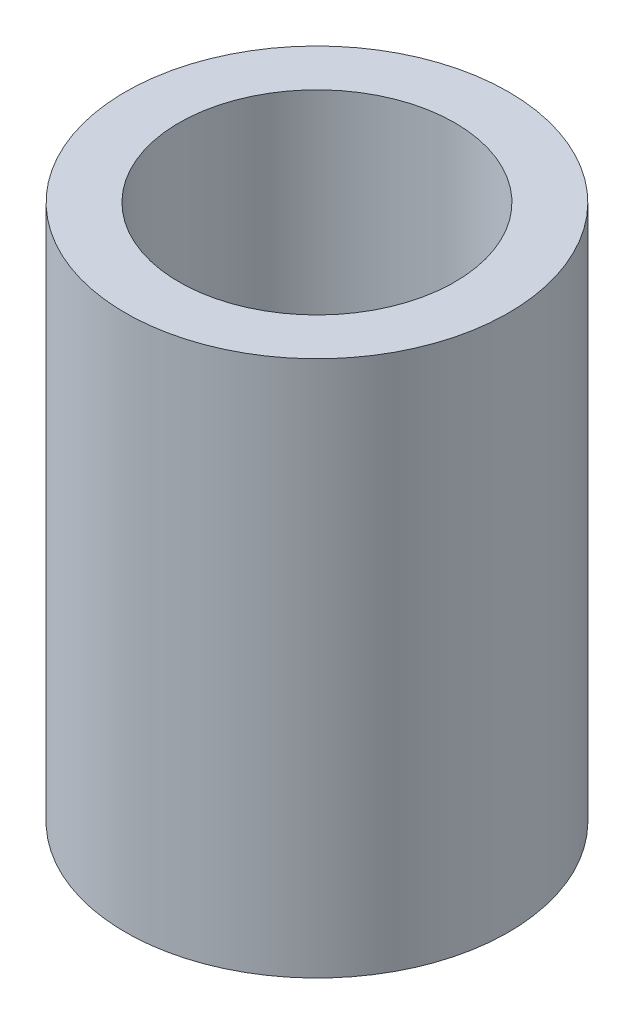
ISO-10303-21;
HEADER;
FILE_DESCRIPTION(('STEP AP214'),'2;1');
FILE_NAME('part.step','',(''),(''),'','','');
FILE_SCHEMA(('AUTOMOTIVE_DESIGN { 1 0 10303 214 1 1 1 1 }'));
ENDSEC;
DATA;
#1=APPLICATION_CONTEXT('core data for automotive mechanical design processes');
#2=APPLICATION_PROTOCOL_DEFINITION('international standard','automotive_design',2000,#1);
#3=PRODUCT_CONTEXT('',#1,'mechanical');
#4=PRODUCT('Part','Part','',(#3));
#5=PRODUCT_RELATED_PRODUCT_CATEGORY('part','',(#4));
#6=PRODUCT_DEFINITION_FORMATION('','',#4);
#7=PRODUCT_DEFINITION_CONTEXT('part definition',#1,'design');
#8=PRODUCT_DEFINITION('design','',#6,#7);
#9=PRODUCT_DEFINITION_SHAPE('','',#8);
#10=(LENGTH_UNIT() NAMED_UNIT(*) SI_UNIT(.MILLI.,.METRE.));
#11=(NAMED_UNIT(*) PLANE_ANGLE_UNIT() SI_UNIT($,.RADIAN.));
#12=(NAMED_UNIT(*) SI_UNIT($,.STERADIAN.) SOLID_ANGLE_UNIT());
#13=UNCERTAINTY_MEASURE_WITH_UNIT(LENGTH_MEASURE(1.E-05),#10,'distance_accuracy_value','');
#14=(GEOMETRIC_REPRESENTATION_CONTEXT(3) GLOBAL_UNCERTAINTY_ASSIGNED_CONTEXT((#13)) GLOBAL_UNIT_ASSIGNED_CONTEXT((#10,
#11,#12)) REPRESENTATION_CONTEXT('',''));
#15=CARTESIAN_POINT('',(0.,0.,0.));
#16=DIRECTION('',(0.,0.,1.));
#17=DIRECTION('',(1.,0.,0.));
#18=AXIS2_PLACEMENT_3D('',#15,#16,#17);
#19=CARTESIAN_POINT('',(11.,0.,0.));
#20=DIRECTION('',(0.,-1.,0.));
#21=DIRECTION('',(0.,0.,-1.));
#22=AXIS2_PLACEMENT_3D('',#19,#20,#21);
#23=PLANE('',#22);
#24=CARTESIAN_POINT('',(0.,0.,0.));
#25=DIRECTION('',(0.,-1.,0.));
#26=DIRECTION('',(0.,0.,-1.));
#27=AXIS2_PLACEMENT_3D('',#24,#25,#26);
#28=CIRCLE('',#27,12.5);
#29=CARTESIAN_POINT('',(0.,0.,-12.5));
#30=VERTEX_POINT('',#29);
#31=EDGE_CURVE('E10',#30,#30,#28,.T.);
#32=ORIENTED_EDGE('',*,*,#31,.T.);
#33=EDGE_LOOP('',(#32));
#34=FACE_BOUND('',#33,.T.);
#35=CARTESIAN_POINT('',(0.,0.,0.));
#36=DIRECTION('',(0.,-1.,0.));
#37=DIRECTION('',(0.,0.,-1.));
#38=AXIS2_PLACEMENT_3D('',#35,#36,#37);
#39=CIRCLE('',#38,11.);
#40=CARTESIAN_POINT('',(0.,0.,-11.));
#41=VERTEX_POINT('',#40);
#42=EDGE_CURVE('E72',#41,#41,#39,.T.);
#43=ORIENTED_EDGE('',*,*,#42,.F.);
#44=EDGE_LOOP('',(#43));
#45=FACE_BOUND('',#44,.T.);
#46=ADVANCED_FACE('F43',(#34,#45),#23,.T.);
#47=CARTESIAN_POINT('',(0.,0.,0.));
#48=DIRECTION('',(0.,-1.,0.));
#49=DIRECTION('',(0.,0.,-1.));
#50=AXIS2_PLACEMENT_3D('',#47,#48,#49);
#51=CYLINDRICAL_SURFACE('',#50,12.5);
#52=CARTESIAN_POINT('',(0.,35.,0.));
#53=DIRECTION('',(0.,-1.,0.));
#54=DIRECTION('',(0.,0.,-1.));
#55=AXIS2_PLACEMENT_3D('',#52,#53,#54);
#56=CIRCLE('',#55,12.5);
#57=CARTESIAN_POINT('',(0.,35.,-12.5));
#58=VERTEX_POINT('',#57);
#59=EDGE_CURVE('E49',#58,#58,#56,.T.);
#60=ORIENTED_EDGE('',*,*,#59,.T.);
#61=EDGE_LOOP('',(#60));
#62=FACE_BOUND('',#61,.T.);
#63=ORIENTED_EDGE('',*,*,#31,.F.);
#64=EDGE_LOOP('',(#63));
#65=FACE_BOUND('',#64,.T.);
#66=ADVANCED_FACE('F80',(#62,#65),#51,.T.);
#67=CARTESIAN_POINT('',(12.5,35.,0.));
#68=DIRECTION('',(0.,1.,0.));
#69=DIRECTION('',(0.,0.,1.));
#70=AXIS2_PLACEMENT_3D('',#67,#68,#69);
#71=PLANE('',#70);
#72=CARTESIAN_POINT('',(0.,35.,0.));
#73=DIRECTION('',(0.,-1.,0.));
#74=DIRECTION('',(0.,0.,-1.));
#75=AXIS2_PLACEMENT_3D('',#72,#73,#74);
#76=CIRCLE('',#75,9.);
#77=CARTESIAN_POINT('',(0.,35.,-9.));
#78=VERTEX_POINT('',#77);
#79=EDGE_CURVE('E60',#78,#78,#76,.T.);
#80=ORIENTED_EDGE('',*,*,#79,.T.);
#81=EDGE_LOOP('',(#80));
#82=FACE_BOUND('',#81,.T.);
#83=ORIENTED_EDGE('',*,*,#59,.F.);
#84=EDGE_LOOP('',(#83));
#85=FACE_BOUND('',#84,.T.);
#86=ADVANCED_FACE('F84',(#82,#85),#71,.T.);
#87=CARTESIAN_POINT('',(0.,0.,0.));
#88=DIRECTION('',(0.,-1.,0.));
#89=DIRECTION('',(0.,0.,-1.));
#90=AXIS2_PLACEMENT_3D('',#87,#88,#89);
#91=CYLINDRICAL_SURFACE('',#90,9.);
#92=CARTESIAN_POINT('',(0.,11.,0.));
#93=DIRECTION('',(0.,-1.,0.));
#94=DIRECTION('',(0.,0.,-1.));
#95=AXIS2_PLACEMENT_3D('',#92,#93,#94);
#96=CIRCLE('',#95,9.);
#97=CARTESIAN_POINT('',(0.,11.,-9.));
#98=VERTEX_POINT('',#97);
#99=EDGE_CURVE('E62',#98,#98,#96,.T.);
#100=ORIENTED_EDGE('',*,*,#99,.T.);
#101=EDGE_LOOP('',(#100));
#102=FACE_BOUND('',#101,.T.);
#103=ORIENTED_EDGE('',*,*,#79,.F.);
#104=EDGE_LOOP('',(#103));
#105=FACE_BOUND('',#104,.T.);
#106=ADVANCED_FACE('F90',(#102,#105),#91,.F.);
#107=CARTESIAN_POINT('',(9.,11.,0.));
#108=DIRECTION('',(0.,-1.,0.));
#109=DIRECTION('',(0.,0.,-1.));
#110=AXIS2_PLACEMENT_3D('',#107,#108,#109);
#111=PLANE('',#110);
#112=CARTESIAN_POINT('',(0.,11.,0.));
#113=DIRECTION('',(0.,-1.,0.));
#114=DIRECTION('',(0.,0.,-1.));
#115=AXIS2_PLACEMENT_3D('',#112,#113,#114);
#116=CIRCLE('',#115,11.);
#117=CARTESIAN_POINT('',(0.,11.,-11.));
#118=VERTEX_POINT('',#117);
#119=EDGE_CURVE('E70',#118,#118,#116,.T.);
#120=ORIENTED_EDGE('',*,*,#119,.T.);
#121=EDGE_LOOP('',(#120));
#122=FACE_BOUND('',#121,.T.);
#123=ORIENTED_EDGE('',*,*,#99,.F.);
#124=EDGE_LOOP('',(#123));
#125=FACE_BOUND('',#124,.T.);
#126=ADVANCED_FACE('F93',(#122,#125),#111,.T.);
#127=CARTESIAN_POINT('',(0.,0.,0.));
#128=DIRECTION('',(0.,-1.,0.));
#129=DIRECTION('',(0.,0.,-1.));
#130=AXIS2_PLACEMENT_3D('',#127,#128,#129);
#131=CYLINDRICAL_SURFACE('',#130,11.);
#132=ORIENTED_EDGE('',*,*,#42,.T.);
#133=EDGE_LOOP('',(#132));
#134=FACE_BOUND('',#133,.T.);
#135=ORIENTED_EDGE('',*,*,#119,.F.);
#136=EDGE_LOOP('',(#135));
#137=FACE_BOUND('',#136,.T.);
#138=ADVANCED_FACE('F73',(#134,#137),#131,.F.);
#139=CLOSED_SHELL('',(#46,#66,#86,#106,#126,#138));
#140=MANIFOLD_SOLID_BREP('B2',#139);
#141=ADVANCED_BREP_SHAPE_REPRESENTATION('',(#18,#140),#14);
#142=SHAPE_DEFINITION_REPRESENTATION(#9,#141);
ENDSEC;
END-ISO-10303-21;
